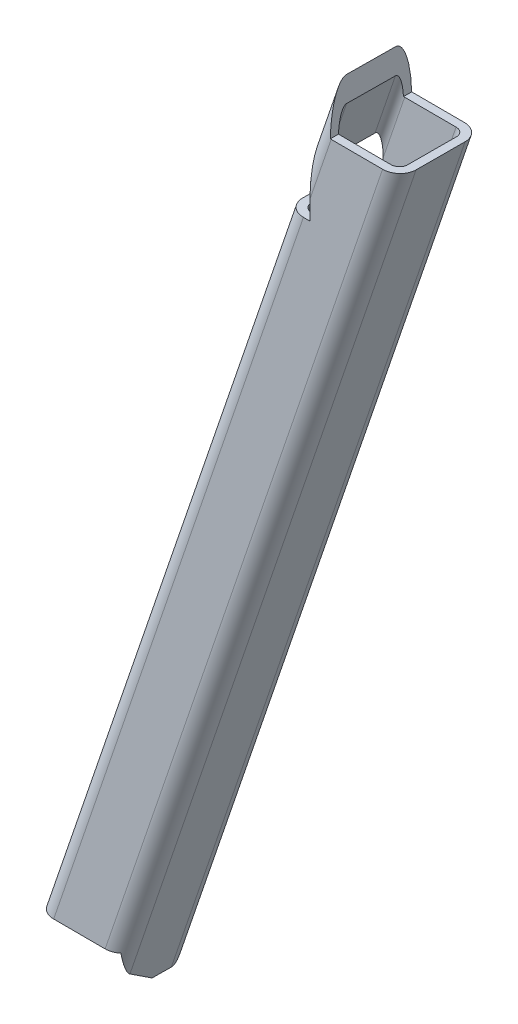
ISO-10303-21;
HEADER;
FILE_DESCRIPTION(('STEP AP214'),'2;1');
FILE_NAME('part.step','',(''),(''),'','','');
FILE_SCHEMA(('AUTOMOTIVE_DESIGN { 1 0 10303 214 1 1 1 1 }'));
ENDSEC;
DATA;
#1=APPLICATION_CONTEXT('core data for automotive mechanical design processes');
#2=APPLICATION_PROTOCOL_DEFINITION('international standard','automotive_design',2000,#1);
#3=PRODUCT_CONTEXT('',#1,'mechanical');
#4=PRODUCT('Part','Part','',(#3));
#5=PRODUCT_RELATED_PRODUCT_CATEGORY('part','',(#4));
#6=PRODUCT_DEFINITION_FORMATION('','',#4);
#7=PRODUCT_DEFINITION_CONTEXT('part definition',#1,'design');
#8=PRODUCT_DEFINITION('design','',#6,#7);
#9=PRODUCT_DEFINITION_SHAPE('','',#8);
#10=(LENGTH_UNIT() NAMED_UNIT(*) SI_UNIT(.MILLI.,.METRE.));
#11=(NAMED_UNIT(*) PLANE_ANGLE_UNIT() SI_UNIT($,.RADIAN.));
#12=(NAMED_UNIT(*) SI_UNIT($,.STERADIAN.) SOLID_ANGLE_UNIT());
#13=UNCERTAINTY_MEASURE_WITH_UNIT(LENGTH_MEASURE(1.E-05),#10,'distance_accuracy_value','');
#14=(GEOMETRIC_REPRESENTATION_CONTEXT(3) GLOBAL_UNCERTAINTY_ASSIGNED_CONTEXT((#13)) GLOBAL_UNIT_ASSIGNED_CONTEXT((#10,
#11,#12)) REPRESENTATION_CONTEXT('',''));
#15=CARTESIAN_POINT('',(0.,0.,0.));
#16=DIRECTION('',(0.,0.,1.));
#17=DIRECTION('',(1.,0.,0.));
#18=AXIS2_PLACEMENT_3D('',#15,#16,#17);
#19=CARTESIAN_POINT('',(244.349922816068,221.92616267634,-2010.01830949611));
#20=DIRECTION('',(-0.00289573675776996,0.000987182985603394,0.999995320078241));
#21=DIRECTION('',(0.99999580734144,0.,0.00289573816876252));
#22=AXIS2_PLACEMENT_3D('',#19,#20,#21);
#23=PLANE('',#22);
#24=DIRECTION('',(-0.99999580734144,0.,-0.00289573816876252));
#25=VECTOR('',#24,1.);
#26=CARTESIAN_POINT('',(244.349831551146,190.,-2009.98679264831));
#27=LINE('',#26,#25);
#28=CARTESIAN_POINT('',(235.,190.,-2010.01386742591));
#29=VERTEX_POINT('',#28);
#30=CARTESIAN_POINT('',(233.466003721887,190.,-2010.01830949611));
#31=VERTEX_POINT('',#30);
#32=EDGE_CURVE('E229',#29,#31,#27,.T.);
#33=ORIENTED_EDGE('',*,*,#32,.F.);
#34=DIRECTION('',(0.,-0.999999512730672,0.000987187124537908));
#35=VECTOR('',#34,1.);
#36=CARTESIAN_POINT('',(235.,221.926135948221,-2010.04538451162));
#37=LINE('',#36,#35);
#38=CARTESIAN_POINT('',(235.,194.499722415875,-2010.01830949611));
#39=VERTEX_POINT('',#38);
#40=EDGE_CURVE('E450',#39,#29,#37,.T.);
#41=ORIENTED_EDGE('',*,*,#40,.F.);
#42=DIRECTION('',(-0.322673927788139,-0.94651018817854,0.));
#43=VECTOR('',#42,1.);
#44=CARTESIAN_POINT('',(244.349922816068,221.92616267634,-2010.01830949611));
#45=LINE('',#44,#43);
#46=CARTESIAN_POINT('',(240.284185539947,210.,-2010.01830949611));
#47=VERTEX_POINT('',#46);
#48=EDGE_CURVE('E248',#47,#39,#45,.T.);
#49=ORIENTED_EDGE('',*,*,#48,.F.);
#50=DIRECTION('',(-0.99999580734144,0.,-0.00289573816876252));
#51=VECTOR('',#50,1.);
#52=CARTESIAN_POINT('',(244.349888723643,210.,-2010.00653623486));
#53=LINE('',#52,#51);
#54=CARTESIAN_POINT('',(252.962278170014,210.,-2009.98159690545));
#55=VERTEX_POINT('',#54);
#56=EDGE_CURVE('E281',#55,#47,#53,.T.);
#57=ORIENTED_EDGE('',*,*,#56,.F.);
#58=DIRECTION('',(-0.322673927788139,-0.94651018817854,0.));
#59=VECTOR('',#58,1.);
#60=CARTESIAN_POINT('',(255.707991919087,218.054093663948,-2009.98159690545));
#61=LINE('',#60,#59);
#62=CARTESIAN_POINT('',(184.780459988186,10.,-2009.98159690545));
#63=VERTEX_POINT('',#62);
#64=EDGE_CURVE('E45',#55,#63,#61,.T.);
#65=ORIENTED_EDGE('',*,*,#64,.T.);
#66=DIRECTION('',(0.99999580734144,0.,0.00289573816876252));
#67=VECTOR('',#66,1.);
#68=CARTESIAN_POINT('',(244.349316998674,10.,-2009.80910036932));
#69=LINE('',#68,#67);
#70=CARTESIAN_POINT('',(172.102367358225,9.99999999999998,-2010.01830949611));
#71=VERTEX_POINT('',#70);
#72=EDGE_CURVE('E247',#71,#63,#69,.T.);
#73=ORIENTED_EDGE('',*,*,#72,.F.);
#74=EDGE_CURVE('E240',#31,#71,#45,.T.);
#75=ORIENTED_EDGE('',*,*,#74,.F.);
#76=EDGE_LOOP('',(#33,#41,#49,#57,#65,#73,#75));
#77=FACE_BOUND('',#76,.T.);
#78=ADVANCED_FACE('F41',(#77),#23,.F.);
#79=CARTESIAN_POINT('',(255.696408972056,218.05804239589,-2005.98161562514));
#80=DIRECTION('',(-0.322673927788139,-0.94651018817854,0.));
#81=DIRECTION('',(0.94651018817854,-0.322673927788139,0.));
#82=AXIS2_PLACEMENT_3D('',#79,#80,#81);
#83=CYLINDRICAL_SURFACE('',#82,3.99999999999994);
#84=CARTESIAN_POINT('',(252.949349064366,210.,-2005.98161562514));
#85=DIRECTION('',(0.,1.,0.));
#86=DIRECTION('',(-1.,0.,0.));
#87=AXIS2_PLACEMENT_3D('',#84,#85,#86);
#88=ELLIPSE('',#87,4.22605065424338,3.99999999999994);
#89=CARTESIAN_POINT('',(257.175379941023,210.,-2005.96937809492));
#90=VERTEX_POINT('',#89);
#91=EDGE_CURVE('E285',#90,#55,#88,.T.);
#92=ORIENTED_EDGE('',*,*,#91,.F.);
#93=DIRECTION('',(-0.322673927788139,-0.94651018817854,0.));
#94=VECTOR('',#93,1.);
#95=CARTESIAN_POINT('',(259.482432006396,216.767352725092,-2005.96937809492));
#96=LINE('',#95,#94);
#97=CARTESIAN_POINT('',(185.,-1.71444782700178,-2005.96937809492));
#98=VERTEX_POINT('',#97);
#99=EDGE_CURVE('E272',#90,#98,#96,.T.);
#100=ORIENTED_EDGE('',*,*,#99,.T.);
#101=CARTESIAN_POINT('',(185.,10.681909411192,-2005.98161562514));
#102=DIRECTION('',(-1.,0.,0.));
#103=DIRECTION('',(0.,-1.,0.));
#104=AXIS2_PLACEMENT_3D('',#101,#102,#103);
#105=ELLIPSE('',#104,12.3964152524473,3.99999999999994);
#106=CARTESIAN_POINT('',(185.,10.,-2009.97555914853));
#107=VERTEX_POINT('',#106);
#108=EDGE_CURVE('E410',#107,#98,#105,.T.);
#109=ORIENTED_EDGE('',*,*,#108,.F.);
#110=CARTESIAN_POINT('',(184.767530882548,10.,-2005.98161562514));
#111=DIRECTION('',(0.,-1.,0.));
#112=DIRECTION('',(-1.,0.,0.));
#113=AXIS2_PLACEMENT_3D('',#110,#111,#112);
#114=ELLIPSE('',#113,4.22605065424338,3.99999999999994);
#115=EDGE_CURVE('E286',#63,#107,#114,.T.);
#116=ORIENTED_EDGE('',*,*,#115,.F.);
#117=ORIENTED_EDGE('',*,*,#64,.F.);
#118=EDGE_LOOP('',(#92,#100,#109,#116,#117));
#119=FACE_BOUND('',#118,.T.);
#120=ADVANCED_FACE('F283',(#119),#83,.T.);
#121=CARTESIAN_POINT('',(259.447683165303,216.77919892092,-1993.96943425398));
#122=DIRECTION('',(-0.946505758584915,0.322672417699403,-0.00305938255490178));
#123=DIRECTION('',(-0.322673927788139,-0.94651018817854,0.));
#124=AXIS2_PLACEMENT_3D('',#121,#122,#123);
#125=PLANE('',#124);
#126=DIRECTION('',(0.00323227465391467,0.,-0.999994776186637));
#127=VECTOR('',#126,1.);
#128=CARTESIAN_POINT('',(257.136616769428,210.,-1993.97690429434));
#129=LINE('',#128,#127);
#130=CARTESIAN_POINT('',(257.13659262408,210.,-1993.96943425398));
#131=VERTEX_POINT('',#130);
#132=EDGE_CURVE('E364',#131,#90,#129,.T.);
#133=ORIENTED_EDGE('',*,*,#132,.F.);
#134=DIRECTION('',(-0.322673927788139,-0.94651018817854,0.));
#135=VECTOR('',#134,1.);
#136=CARTESIAN_POINT('',(259.447683165303,216.77919892092,-1993.96943425398));
#137=LINE('',#136,#135);
#138=CARTESIAN_POINT('',(186.815405500549,3.7245177709752,-1993.96943425398));
#139=VERTEX_POINT('',#138);
#140=EDGE_CURVE('E270',#131,#139,#137,.T.);
#141=ORIENTED_EDGE('',*,*,#140,.T.);
#142=DIRECTION('',(0.196766618222741,0.584644563135723,0.787066472890966));
#143=VECTOR('',#142,1.);
#144=CARTESIAN_POINT('',(214.137014892353,84.9040924941325,-1884.68299668677));
#145=LINE('',#144,#143);
#146=CARTESIAN_POINT('',(185.,-1.66952195674525,-2001.23105625618));
#147=VERTEX_POINT('',#146);
#148=EDGE_CURVE('E478',#147,#139,#145,.T.);
#149=ORIENTED_EDGE('',*,*,#148,.F.);
#150=DIRECTION('',(0.,0.00948096236964959,0.999955054666231));
#151=VECTOR('',#150,1.);
#152=CARTESIAN_POINT('',(185.,-1.58104182610064,-1991.89907597549));
#153=LINE('',#152,#151);
#154=EDGE_CURVE('E411',#98,#147,#153,.T.);
#155=ORIENTED_EDGE('',*,*,#154,.F.);
#156=ORIENTED_EDGE('',*,*,#99,.F.);
#157=EDGE_LOOP('',(#133,#141,#149,#155,#156));
#158=FACE_BOUND('',#157,.T.);
#159=ADVANCED_FACE('F482',(#158),#125,.F.);
#160=CARTESIAN_POINT('',(255.661660130963,218.069888591717,-1993.9816717842));
#161=DIRECTION('',(-0.322673927788139,-0.94651018817854,0.));
#162=DIRECTION('',(0.94651018817854,-0.322673927788139,0.));
#163=AXIS2_PLACEMENT_3D('',#160,#161,#162);
#164=CYLINDRICAL_SURFACE('',#163,3.99999999999996);
#165=CARTESIAN_POINT('',(252.910561747423,210.,-1993.9816717842));
#166=DIRECTION('',(0.,1.,0.));
#167=DIRECTION('',(-1.,0.,0.));
#168=AXIS2_PLACEMENT_3D('',#165,#166,#167);
#169=ELLIPSE('',#168,4.2260506542434,3.99999999999996);
#170=CARTESIAN_POINT('',(252.897632641775,210.,-1989.98169050389));
#171=VERTEX_POINT('',#170);
#172=EDGE_CURVE('E362',#171,#131,#169,.T.);
#173=ORIENTED_EDGE('',*,*,#172,.F.);
#174=DIRECTION('',(-0.322673927788139,-0.94651018817854,0.));
#175=VECTOR('',#174,1.);
#176=CARTESIAN_POINT('',(255.650077183932,218.07383732366,-1989.98169050389));
#177=LINE('',#176,#175);
#178=CARTESIAN_POINT('',(184.715814459933,10.,-1989.98169050389));
#179=VERTEX_POINT('',#178);
#180=EDGE_CURVE('E267',#171,#179,#177,.T.);
#181=ORIENTED_EDGE('',*,*,#180,.T.);
#182=CARTESIAN_POINT('',(184.728743565605,10.,-1993.9816717842));
#183=DIRECTION('',(0.,-1.,0.));
#184=DIRECTION('',(-1.,0.,0.));
#185=AXIS2_PLACEMENT_3D('',#182,#183,#184);
#186=ELLIPSE('',#185,4.2260506542434,3.99999999999996);
#187=CARTESIAN_POINT('',(187.555672242524,10.,-1991.00836728608));
#188=VERTEX_POINT('',#187);
#189=EDGE_CURVE('E390',#188,#179,#186,.T.);
#190=ORIENTED_EDGE('',*,*,#189,.F.);
#191=CARTESIAN_POINT('',(186.812346117994,16.1119008203417,-1993.9816717842));
#192=DIRECTION('',(-0.970142500145332,0.,0.242535625036333));
#193=DIRECTION('',(-0.0199852784923983,-0.996599220820929,-0.0799411139695932));
#194=AXIS2_PLACEMENT_3D('',#191,#192,#193);
#195=ELLIPSE('',#194,12.7779323662145,3.99999999999996);
#196=EDGE_CURVE('E189',#139,#188,#195,.T.);
#197=ORIENTED_EDGE('',*,*,#196,.F.);
#198=ORIENTED_EDGE('',*,*,#140,.F.);
#199=EDGE_LOOP('',(#173,#181,#190,#197,#198));
#200=FACE_BOUND('',#199,.T.);
#201=ADVANCED_FACE('F564',(#200),#164,.T.);
#202=CARTESIAN_POINT('',(255.650077183932,218.07383732366,-1989.98169050389));
#203=DIRECTION('',(0.00289573675776996,-0.000987182985603394,-0.999995320078241));
#204=DIRECTION('',(-0.99999580734144,0.,-0.00289573816876252));
#205=AXIS2_PLACEMENT_3D('',#202,#203,#204);
#206=PLANE('',#205);
#207=DIRECTION('',(0.99999580734144,0.,0.00289573816876252));
#208=VECTOR('',#207,1.);
#209=CARTESIAN_POINT('',(255.649996931363,190.,-1989.95397659203));
#210=LINE('',#209,#208);
#211=CARTESIAN_POINT('',(233.401358193622,190.,-1990.01840309455));
#212=VERTEX_POINT('',#211);
#213=CARTESIAN_POINT('',(235.,190.,-1990.01377382704));
#214=VERTEX_POINT('',#213);
#215=EDGE_CURVE('E451',#212,#214,#210,.T.);
#216=ORIENTED_EDGE('',*,*,#215,.F.);
#217=DIRECTION('',(-0.322673927788139,-0.94651018817854,0.));
#218=VECTOR('',#217,1.);
#219=CARTESIAN_POINT('',(244.292008080913,221.945906336052,-1990.01840309455));
#220=LINE('',#219,#218);
#221=CARTESIAN_POINT('',(172.037721829986,10.,-1990.01840309455));
#222=VERTEX_POINT('',#221);
#223=EDGE_CURVE('E266',#212,#222,#220,.T.);
#224=ORIENTED_EDGE('',*,*,#223,.T.);
#225=DIRECTION('',(-0.99999580734144,0.,-0.00289573816876252));
#226=VECTOR('',#225,1.);
#227=CARTESIAN_POINT('',(255.649482378891,10.,-1989.77628431305));
#228=LINE('',#227,#226);
#229=EDGE_CURVE('E392',#179,#222,#228,.T.);
#230=ORIENTED_EDGE('',*,*,#229,.F.);
#231=ORIENTED_EDGE('',*,*,#180,.F.);
#232=DIRECTION('',(0.99999580734144,0.,0.00289573816876252));
#233=VECTOR('',#232,1.);
#234=CARTESIAN_POINT('',(255.65005410386,210.,-1989.97372017859));
#235=LINE('',#234,#233);
#236=CARTESIAN_POINT('',(240.219540011848,210.,-1990.01840309455));
#237=VERTEX_POINT('',#236);
#238=EDGE_CURVE('E359',#237,#171,#235,.T.);
#239=ORIENTED_EDGE('',*,*,#238,.F.);
#240=CARTESIAN_POINT('',(235.,194.689349298708,-1990.01840309455));
#241=VERTEX_POINT('',#240);
#242=EDGE_CURVE('E263',#237,#241,#220,.T.);
#243=ORIENTED_EDGE('',*,*,#242,.T.);
#244=DIRECTION('',(0.,0.999999512730672,-0.000987187124537908));
#245=VECTOR('',#244,1.);
#246=CARTESIAN_POINT('',(235.,218.073778292398,-1990.04148791301));
#247=LINE('',#246,#245);
#248=EDGE_CURVE('E464',#214,#241,#247,.T.);
#249=ORIENTED_EDGE('',*,*,#248,.F.);
#250=EDGE_LOOP('',(#216,#224,#230,#231,#239,#243,#249));
#251=FACE_BOUND('',#250,.T.);
#252=ADVANCED_FACE('F528',(#251),#206,.F.);
#253=CARTESIAN_POINT('',(244.303591027944,221.94195760411,-1994.01838437486));
#254=DIRECTION('',(-0.322673927788139,-0.94651018817854,0.));
#255=DIRECTION('',(0.94651018817854,-0.322673927788139,0.));
#256=AXIS2_PLACEMENT_3D('',#253,#254,#255);
#257=CYLINDRICAL_SURFACE('',#256,3.99999999999994);
#258=CARTESIAN_POINT('',(233.41428729927,190.,-1994.01838437486));
#259=DIRECTION('',(0.,1.,0.));
#260=DIRECTION('',(-1.,0.,0.));
#261=AXIS2_PLACEMENT_3D('',#258,#259,#260);
#262=ELLIPSE('',#261,4.22605065424338,3.99999999999994);
#263=CARTESIAN_POINT('',(229.188256422613,190.,-1994.03062190508));
#264=VERTEX_POINT('',#263);
#265=EDGE_CURVE('E453',#264,#212,#262,.T.);
#266=ORIENTED_EDGE('',*,*,#265,.F.);
#267=DIRECTION('',(-0.322673927788139,-0.94651018817854,0.));
#268=VECTOR('',#267,1.);
#269=CARTESIAN_POINT('',(240.517567993604,223.232647274908,-1994.03062190508));
#270=LINE('',#269,#268);
#271=CARTESIAN_POINT('',(167.824620058977,10.,-1994.03062190508));
#272=VERTEX_POINT('',#271);
#273=EDGE_CURVE('E262',#264,#272,#270,.T.);
#274=ORIENTED_EDGE('',*,*,#273,.T.);
#275=CARTESIAN_POINT('',(172.050650935634,10.,-1994.01838437486));
#276=DIRECTION('',(0.,-1.,0.));
#277=DIRECTION('',(-1.,0.,0.));
#278=AXIS2_PLACEMENT_3D('',#275,#276,#277);
#279=ELLIPSE('',#278,4.22605065424338,3.99999999999994);
#280=EDGE_CURVE('E394',#222,#272,#279,.T.);
#281=ORIENTED_EDGE('',*,*,#280,.F.);
#282=ORIENTED_EDGE('',*,*,#223,.F.);
#283=EDGE_LOOP('',(#266,#274,#281,#282));
#284=FACE_BOUND('',#283,.T.);
#285=ADVANCED_FACE('F532',(#284),#257,.T.);
#286=CARTESIAN_POINT('',(235.,194.651423922141,-1994.01838437486));
#287=DIRECTION('',(-1.,0.,0.));
#288=DIRECTION('',(0.,-1.,0.));
#289=AXIS2_PLACEMENT_3D('',#286,#287,#288);
#290=ELLIPSE('',#289,12.3964152524473,3.99999999999994);
#291=CARTESIAN_POINT('',(235.,207.047781160335,-1994.03062190508));
#292=VERTEX_POINT('',#291);
#293=EDGE_CURVE('E466',#241,#292,#290,.T.);
#294=ORIENTED_EDGE('',*,*,#293,.F.);
#295=ORIENTED_EDGE('',*,*,#242,.F.);
#296=CARTESIAN_POINT('',(240.232469117452,210.,-1994.01838437486));
#297=DIRECTION('',(0.,1.,0.));
#298=DIRECTION('',(-1.,0.,0.));
#299=AXIS2_PLACEMENT_3D('',#296,#297,#298);
#300=ELLIPSE('',#299,4.22605065424338,3.99999999999994);
#301=CARTESIAN_POINT('',(240.,210.,-1990.02444085147));
#302=VERTEX_POINT('',#301);
#303=EDGE_CURVE('E357',#302,#237,#300,.T.);
#304=ORIENTED_EDGE('',*,*,#303,.F.);
#305=CARTESIAN_POINT('',(240.,209.318090588808,-1994.01838437486));
#306=DIRECTION('',(1.,0.,0.));
#307=DIRECTION('',(0.,-1.,0.));
#308=AXIS2_PLACEMENT_3D('',#305,#306,#307);
#309=ELLIPSE('',#308,12.3964152524473,3.99999999999994);
#310=CARTESIAN_POINT('',(240.,221.714447827001,-1994.03062190508));
#311=VERTEX_POINT('',#310);
#312=EDGE_CURVE('E493',#311,#302,#309,.T.);
#313=ORIENTED_EDGE('',*,*,#312,.F.);
#314=EDGE_CURVE('E259',#311,#292,#270,.T.);
#315=ORIENTED_EDGE('',*,*,#314,.T.);
#316=EDGE_LOOP('',(#294,#295,#304,#313,#315));
#317=FACE_BOUND('',#316,.T.);
#318=ADVANCED_FACE('F542',(#317),#257,.T.);
#319=CARTESIAN_POINT('',(240.552316834697,223.22080107908,-2006.03056574602));
#320=DIRECTION('',(0.946505758584915,-0.322672417699403,0.00305938255490178));
#321=DIRECTION('',(0.322673927788139,0.94651018817854,0.));
#322=AXIS2_PLACEMENT_3D('',#319,#320,#321);
#323=PLANE('',#322);
#324=DIRECTION('',(-0.00323227465391467,0.,0.999994776186637));
#325=VECTOR('',#324,1.);
#326=CARTESIAN_POINT('',(229.227162061473,190.,-2006.06717194797));
#327=LINE('',#326,#325);
#328=CARTESIAN_POINT('',(229.227043739556,190.,-2006.03056574602));
#329=VERTEX_POINT('',#328);
#330=EDGE_CURVE('E243',#329,#264,#327,.T.);
#331=ORIENTED_EDGE('',*,*,#330,.F.);
#332=DIRECTION('',(-0.322673927788139,-0.94651018817854,0.));
#333=VECTOR('',#332,1.);
#334=CARTESIAN_POINT('',(240.552316834697,223.22080107908,-2006.03056574602));
#335=LINE('',#334,#333);
#336=CARTESIAN_POINT('',(167.86340737592,10.,-2006.03056574602));
#337=VERTEX_POINT('',#336);
#338=EDGE_CURVE('E242',#329,#337,#335,.T.);
#339=ORIENTED_EDGE('',*,*,#338,.T.);
#340=DIRECTION('',(0.00323227465391467,0.,-0.999994776186637));
#341=VECTOR('',#340,1.);
#342=CARTESIAN_POINT('',(167.86416680053,10.,-2006.26551503835));
#343=LINE('',#342,#341);
#344=EDGE_CURVE('E396',#272,#337,#343,.T.);
#345=ORIENTED_EDGE('',*,*,#344,.F.);
#346=ORIENTED_EDGE('',*,*,#273,.F.);
#347=EDGE_LOOP('',(#331,#339,#345,#346));
#348=FACE_BOUND('',#347,.T.);
#349=ADVANCED_FACE('F539',(#348),#323,.F.);
#350=DIRECTION('',(0.,-0.00948096236964905,-0.999955054666231));
#351=VECTOR('',#350,1.);
#352=CARTESIAN_POINT('',(235.,206.935469028704,-2005.87615818577));
#353=LINE('',#352,#351);
#354=CARTESIAN_POINT('',(235.,206.934005030635,-2006.03056574602));
#355=VERTEX_POINT('',#354);
#356=EDGE_CURVE('E468',#292,#355,#353,.T.);
#357=ORIENTED_EDGE('',*,*,#356,.F.);
#358=ORIENTED_EDGE('',*,*,#314,.F.);
#359=DIRECTION('',(0.,0.00948096236964905,0.999955054666231));
#360=VECTOR('',#359,1.);
#361=CARTESIAN_POINT('',(240.,221.60081732854,-2006.01520605069));
#362=LINE('',#361,#360);
#363=CARTESIAN_POINT('',(240.,221.600671697302,-2006.03056574602));
#364=VERTEX_POINT('',#363);
#365=EDGE_CURVE('E495',#364,#311,#362,.T.);
#366=ORIENTED_EDGE('',*,*,#365,.F.);
#367=EDGE_CURVE('E249',#364,#355,#335,.T.);
#368=ORIENTED_EDGE('',*,*,#367,.T.);
#369=EDGE_LOOP('',(#357,#358,#366,#368));
#370=FACE_BOUND('',#369,.T.);
#371=ADVANCED_FACE('F541',(#370),#323,.F.);
#372=CARTESIAN_POINT('',(244.338339869037,221.930111408283,-2006.0183282158));
#373=DIRECTION('',(-0.322673927788139,-0.94651018817854,0.));
#374=DIRECTION('',(0.94651018817854,-0.322673927788139,0.));
#375=AXIS2_PLACEMENT_3D('',#372,#373,#374);
#376=CYLINDRICAL_SURFACE('',#375,3.99999999999996);
#377=CARTESIAN_POINT('',(233.453074616213,190.,-2006.0183282158));
#378=DIRECTION('',(0.,1.,0.));
#379=DIRECTION('',(-1.,0.,0.));
#380=AXIS2_PLACEMENT_3D('',#377,#378,#379);
#381=ELLIPSE('',#380,4.2260506542434,3.99999999999996);
#382=EDGE_CURVE('E225',#31,#329,#381,.T.);
#383=ORIENTED_EDGE('',*,*,#382,.F.);
#384=ORIENTED_EDGE('',*,*,#74,.T.);
#385=CARTESIAN_POINT('',(172.089438252577,10.,-2006.0183282158));
#386=DIRECTION('',(0.,-1.,0.));
#387=DIRECTION('',(-1.,0.,0.));
#388=AXIS2_PLACEMENT_3D('',#385,#386,#387);
#389=ELLIPSE('',#388,4.2260506542434,3.99999999999996);
#390=EDGE_CURVE('E398',#337,#71,#389,.T.);
#391=ORIENTED_EDGE('',*,*,#390,.F.);
#392=ORIENTED_EDGE('',*,*,#338,.F.);
#393=EDGE_LOOP('',(#383,#384,#391,#392));
#394=FACE_BOUND('',#393,.T.);
#395=ADVANCED_FACE('F43',(#394),#376,.T.);
#396=CARTESIAN_POINT('',(235.,194.537647792441,-2006.0183282158));
#397=DIRECTION('',(-1.,0.,0.));
#398=DIRECTION('',(0.,-1.,0.));
#399=AXIS2_PLACEMENT_3D('',#396,#397,#398);
#400=ELLIPSE('',#399,12.3964152524473,3.99999999999996);
#401=EDGE_CURVE('E470',#355,#39,#400,.T.);
#402=ORIENTED_EDGE('',*,*,#401,.F.);
#403=ORIENTED_EDGE('',*,*,#367,.F.);
#404=CARTESIAN_POINT('',(240.,209.204314459108,-2006.0183282158));
#405=DIRECTION('',(1.,0.,0.));
#406=DIRECTION('',(0.,-1.,0.));
#407=AXIS2_PLACEMENT_3D('',#404,#405,#406);
#408=ELLIPSE('',#407,12.3964152524473,3.99999999999996);
#409=CARTESIAN_POINT('',(240.,210.,-2010.01007983494));
#410=VERTEX_POINT('',#409);
#411=EDGE_CURVE('E487',#410,#364,#408,.T.);
#412=ORIENTED_EDGE('',*,*,#411,.F.);
#413=CARTESIAN_POINT('',(240.271256434395,210.,-2006.0183282158));
#414=DIRECTION('',(0.,1.,0.));
#415=DIRECTION('',(-1.,0.,0.));
#416=AXIS2_PLACEMENT_3D('',#413,#414,#415);
#417=ELLIPSE('',#416,4.2260506542434,3.99999999999996);
#418=EDGE_CURVE('E355',#47,#410,#417,.T.);
#419=ORIENTED_EDGE('',*,*,#418,.F.);
#420=ORIENTED_EDGE('',*,*,#48,.T.);
#421=EDGE_LOOP('',(#402,#403,#412,#419,#420));
#422=FACE_BOUND('',#421,.T.);
#423=ADVANCED_FACE('F614',(#422),#376,.T.);
#424=CARTESIAN_POINT('',(-143.999999999999,10.,-200.));
#425=DIRECTION('',(0.,-1.,0.));
#426=DIRECTION('',(0.,0.,-1.));
#427=AXIS2_PLACEMENT_3D('',#424,#425,#426);
#428=PLANE('',#427);
#429=DIRECTION('',(0.99999580734144,0.,0.00289573816872749));
#430=VECTOR('',#429,1.);
#431=CARTESIAN_POINT('',(244.343525519515,10.,-2007.80910778011));
#432=LINE('',#431,#430);
#433=CARTESIAN_POINT('',(172.095902805401,10.,-2008.01831885596));
#434=VERTEX_POINT('',#433);
#435=CARTESIAN_POINT('',(184.773995435377,10.,-2007.9816062653));
#436=VERTEX_POINT('',#435);
#437=EDGE_CURVE('E368',#434,#436,#432,.T.);
#438=ORIENTED_EDGE('',*,*,#437,.F.);
#439=CARTESIAN_POINT('',(172.089438252577,10.,-2006.0183282158));
#440=DIRECTION('',(0.,-1.,0.));
#441=DIRECTION('',(-1.,0.,0.));
#442=AXIS2_PLACEMENT_3D('',#439,#440,#441);
#443=ELLIPSE('',#442,2.11302532712158,1.99999999999987);
#444=CARTESIAN_POINT('',(169.976422814248,10.,-2006.02444698091));
#445=VERTEX_POINT('',#444);
#446=EDGE_CURVE('E373',#445,#434,#443,.T.);
#447=ORIENTED_EDGE('',*,*,#446,.F.);
#448=DIRECTION('',(0.00323227465391467,0.,-0.999994776186637));
#449=VECTOR('',#448,1.);
#450=CARTESIAN_POINT('',(169.977179940345,10.,-2006.25868516385));
#451=LINE('',#450,#449);
#452=CARTESIAN_POINT('',(169.937635497305,10.,-1994.02450313997));
#453=VERTEX_POINT('',#452);
#454=EDGE_CURVE('E378',#453,#445,#451,.T.);
#455=ORIENTED_EDGE('',*,*,#454,.F.);
#456=CARTESIAN_POINT('',(172.050650935634,10.,-1994.01838437486));
#457=DIRECTION('',(0.,-1.,0.));
#458=DIRECTION('',(-1.,0.,0.));
#459=AXIS2_PLACEMENT_3D('',#456,#457,#458);
#460=ELLIPSE('',#459,2.1130253271218,2.00000000000008);
#461=CARTESIAN_POINT('',(172.04418638281,10.,-1992.0183937347));
#462=VERTEX_POINT('',#461);
#463=EDGE_CURVE('E383',#462,#453,#460,.T.);
#464=ORIENTED_EDGE('',*,*,#463,.F.);
#465=DIRECTION('',(-0.99999580734144,0.,-0.00289573816872749));
#466=VECTOR('',#465,1.);
#467=CARTESIAN_POINT('',(255.655273858051,10.,-1991.77627690226));
#468=LINE('',#467,#466);
#469=CARTESIAN_POINT('',(184.722279012774,10.,-1991.98168114404));
#470=VERTEX_POINT('',#469);
#471=EDGE_CURVE('E343',#470,#462,#468,.T.);
#472=ORIENTED_EDGE('',*,*,#471,.F.);
#473=CARTESIAN_POINT('',(184.728743565605,10.,-1993.9816717842));
#474=DIRECTION('',(0.,-1.,0.));
#475=DIRECTION('',(-1.,0.,0.));
#476=AXIS2_PLACEMENT_3D('',#473,#474,#475);
#477=ELLIPSE('',#476,2.11302532712158,1.99999999999987);
#478=CARTESIAN_POINT('',(186.838807677418,10.,-1993.87582554651));
#479=VERTEX_POINT('',#478);
#480=EDGE_CURVE('E332',#479,#470,#477,.T.);
#481=ORIENTED_EDGE('',*,*,#480,.F.);
#482=DIRECTION('',(0.242535625036333,0.,0.970142500145332));
#483=VECTOR('',#482,1.);
#484=CARTESIAN_POINT('',(184.701425001453,10.,-2002.42535625036));
#485=LINE('',#484,#483);
#486=EDGE_CURVE('E252',#479,#188,#485,.T.);
#487=ORIENTED_EDGE('',*,*,#486,.T.);
#488=ORIENTED_EDGE('',*,*,#189,.T.);
#489=ORIENTED_EDGE('',*,*,#229,.T.);
#490=ORIENTED_EDGE('',*,*,#280,.T.);
#491=ORIENTED_EDGE('',*,*,#344,.T.);
#492=ORIENTED_EDGE('',*,*,#390,.T.);
#493=ORIENTED_EDGE('',*,*,#72,.T.);
#494=ORIENTED_EDGE('',*,*,#115,.T.);
#495=DIRECTION('',(0.,0.,1.));
#496=VECTOR('',#495,1.);
#497=CARTESIAN_POINT('',(185.,10.,-2300.));
#498=LINE('',#497,#496);
#499=CARTESIAN_POINT('',(185.,10.,-2007.96947499342));
#500=VERTEX_POINT('',#499);
#501=EDGE_CURVE('E402',#107,#500,#498,.T.);
#502=ORIENTED_EDGE('',*,*,#501,.T.);
#503=CARTESIAN_POINT('',(184.767530882548,10.,-2005.98161562514));
#504=DIRECTION('',(0.,-1.,0.));
#505=DIRECTION('',(-1.,0.,0.));
#506=AXIS2_PLACEMENT_3D('',#503,#504,#505);
#507=ELLIPSE('',#506,2.1130253271218,2.00000000000008);
#508=EDGE_CURVE('E325',#436,#500,#507,.T.);
#509=ORIENTED_EDGE('',*,*,#508,.F.);
#510=EDGE_LOOP('',(#438,#447,#455,#464,#472,#481,#487,#488,#489,#490,#491,#492,#493,#494,#502,#509));
#511=FACE_BOUND('',#510,.T.);
#512=ADVANCED_FACE('F537',(#511),#428,.T.);
#513=CARTESIAN_POINT('',(184.701425001453,-6.00000000000001,-2002.42535625036));
#514=DIRECTION('',(-0.970142500145332,0.,0.242535625036333));
#515=DIRECTION('',(0.242535625036333,0.,0.970142500145332));
#516=AXIS2_PLACEMENT_3D('',#513,#514,#515);
#517=PLANE('',#516);
#518=ORIENTED_EDGE('',*,*,#196,.T.);
#519=ORIENTED_EDGE('',*,*,#486,.F.);
#520=CARTESIAN_POINT('',(186.812346117994,16.1119008203417,-1993.9816717842));
#521=DIRECTION('',(-0.970142500145332,0.,0.242535625036333));
#522=DIRECTION('',(-0.0199852784923983,-0.996599220820929,-0.0799411139695932));
#523=AXIS2_PLACEMENT_3D('',#520,#521,#522);
#524=ELLIPSE('',#523,6.3889661831069,1.99999999999987);
#525=CARTESIAN_POINT('',(186.813875809272,9.91820929565842,-1993.97555301909));
#526=VERTEX_POINT('',#525);
#527=EDGE_CURVE('E196',#526,#479,#524,.T.);
#528=ORIENTED_EDGE('',*,*,#527,.F.);
#529=DIRECTION('',(0.196766618222741,0.584644563135723,0.787066472890966));
#530=VECTOR('',#529,1.);
#531=CARTESIAN_POINT('',(213.423978839437,88.9837144183653,-1887.53514089843));
#532=LINE('',#531,#530);
#533=CARTESIAN_POINT('',(185.,4.52871467674093,-2001.23105625618));
#534=VERTEX_POINT('',#533);
#535=EDGE_CURVE('E316',#534,#526,#532,.T.);
#536=ORIENTED_EDGE('',*,*,#535,.F.);
#537=DIRECTION('',(0.,1.,0.));
#538=VECTOR('',#537,1.);
#539=CARTESIAN_POINT('',(185.,-6.00000000000001,-2001.23105625618));
#540=LINE('',#539,#538);
#541=EDGE_CURVE('E313',#147,#534,#540,.T.);
#542=ORIENTED_EDGE('',*,*,#541,.F.);
#543=ORIENTED_EDGE('',*,*,#148,.T.);
#544=EDGE_LOOP('',(#518,#519,#528,#536,#542,#543));
#545=FACE_BOUND('',#544,.T.);
#546=ADVANCED_FACE('F476',(#545),#517,.T.);
#547=CARTESIAN_POINT('',(185.,-6.00000000000001,-2300.));
#548=DIRECTION('',(-1.,0.,0.));
#549=DIRECTION('',(0.,0.,1.));
#550=AXIS2_PLACEMENT_3D('',#547,#548,#549);
#551=PLANE('',#550);
#552=ORIENTED_EDGE('',*,*,#154,.T.);
#553=ORIENTED_EDGE('',*,*,#541,.T.);
#554=DIRECTION('',(0.,0.00948096236964959,0.999955054666231));
#555=VECTOR('',#554,1.);
#556=CARTESIAN_POINT('',(185.,4.61663765627793,-1991.95783858254));
#557=LINE('',#556,#555);
#558=CARTESIAN_POINT('',(185.,4.4837307920951,-2005.97549686003));
#559=VERTEX_POINT('',#558);
#560=EDGE_CURVE('E306',#559,#534,#557,.T.);
#561=ORIENTED_EDGE('',*,*,#560,.F.);
#562=CARTESIAN_POINT('',(185.,10.681909411192,-2005.98161562514));
#563=DIRECTION('',(-1.,0.,0.));
#564=DIRECTION('',(0.,-1.,0.));
#565=AXIS2_PLACEMENT_3D('',#562,#563,#564);
#566=ELLIPSE('',#565,6.19820762622395,2.00000000000008);
#567=EDGE_CURVE('E310',#500,#559,#566,.T.);
#568=ORIENTED_EDGE('',*,*,#567,.F.);
#569=ORIENTED_EDGE('',*,*,#501,.F.);
#570=ORIENTED_EDGE('',*,*,#108,.T.);
#571=EDGE_LOOP('',(#552,#553,#561,#568,#569,#570));
#572=FACE_BOUND('',#571,.T.);
#573=ADVANCED_FACE('F308',(#572),#551,.T.);
#574=CARTESIAN_POINT('',(240.,214.,-2000.));
#575=DIRECTION('',(1.,0.,0.));
#576=DIRECTION('',(0.,0.,-1.));
#577=AXIS2_PLACEMENT_3D('',#574,#575,#576);
#578=PLANE('',#577);
#579=ORIENTED_EDGE('',*,*,#411,.T.);
#580=ORIENTED_EDGE('',*,*,#365,.T.);
#581=ORIENTED_EDGE('',*,*,#312,.T.);
#582=DIRECTION('',(0.,0.,-1.));
#583=VECTOR('',#582,1.);
#584=CARTESIAN_POINT('',(240.,210.,-2000.));
#585=LINE('',#584,#583);
#586=CARTESIAN_POINT('',(240.,210.,-1992.03052500658));
#587=VERTEX_POINT('',#586);
#588=EDGE_CURVE('E407',#302,#587,#585,.T.);
#589=ORIENTED_EDGE('',*,*,#588,.T.);
#590=CARTESIAN_POINT('',(240.,209.318090588808,-1994.01838437486));
#591=DIRECTION('',(1.,0.,0.));
#592=DIRECTION('',(0.,-1.,0.));
#593=AXIS2_PLACEMENT_3D('',#590,#591,#592);
#594=ELLIPSE('',#593,6.19820762622395,2.00000000000008);
#595=CARTESIAN_POINT('',(240.,215.516269207904,-1994.02450313997));
#596=VERTEX_POINT('',#595);
#597=EDGE_CURVE('E51',#596,#587,#594,.T.);
#598=ORIENTED_EDGE('',*,*,#597,.F.);
#599=DIRECTION('',(0.,0.00948096236964905,0.999955054666231));
#600=VECTOR('',#599,1.);
#601=CARTESIAN_POINT('',(240.,215.403137846162,-2005.95644344364));
#602=LINE('',#601,#600);
#603=CARTESIAN_POINT('',(240.,215.402493078204,-2006.02444698091));
#604=VERTEX_POINT('',#603);
#605=EDGE_CURVE('E446',#604,#596,#602,.T.);
#606=ORIENTED_EDGE('',*,*,#605,.F.);
#607=CARTESIAN_POINT('',(240.,209.204314459108,-2006.0183282158));
#608=DIRECTION('',(1.,0.,0.));
#609=DIRECTION('',(0.,-1.,0.));
#610=AXIS2_PLACEMENT_3D('',#607,#608,#609);
#611=ELLIPSE('',#610,6.1982076262233,1.99999999999987);
#612=CARTESIAN_POINT('',(240.,210.,-2008.00178000218));
#613=VERTEX_POINT('',#612);
#614=EDGE_CURVE('E442',#613,#604,#611,.T.);
#615=ORIENTED_EDGE('',*,*,#614,.F.);
#616=EDGE_CURVE('E360',#613,#410,#585,.T.);
#617=ORIENTED_EDGE('',*,*,#616,.T.);
#618=EDGE_LOOP('',(#579,#580,#581,#589,#598,#606,#615,#617));
#619=FACE_BOUND('',#618,.T.);
#620=ADVANCED_FACE('F636',(#619),#578,.T.);
#621=CARTESIAN_POINT('',(244.,210.,-2000.));
#622=DIRECTION('',(0.,1.,0.));
#623=DIRECTION('',(0.,0.,1.));
#624=AXIS2_PLACEMENT_3D('',#621,#622,#623);
#625=PLANE('',#624);
#626=ORIENTED_EDGE('',*,*,#588,.F.);
#627=ORIENTED_EDGE('',*,*,#303,.T.);
#628=ORIENTED_EDGE('',*,*,#238,.T.);
#629=ORIENTED_EDGE('',*,*,#172,.T.);
#630=ORIENTED_EDGE('',*,*,#132,.T.);
#631=ORIENTED_EDGE('',*,*,#91,.T.);
#632=ORIENTED_EDGE('',*,*,#56,.T.);
#633=ORIENTED_EDGE('',*,*,#418,.T.);
#634=ORIENTED_EDGE('',*,*,#616,.F.);
#635=CARTESIAN_POINT('',(240.271256434395,210.,-2006.0183282158));
#636=DIRECTION('',(0.,1.,0.));
#637=DIRECTION('',(-1.,0.,0.));
#638=AXIS2_PLACEMENT_3D('',#635,#636,#637);
#639=ELLIPSE('',#638,2.11302532712158,1.99999999999987);
#640=CARTESIAN_POINT('',(240.277720987196,210.,-2008.01831885596));
#641=VERTEX_POINT('',#640);
#642=EDGE_CURVE('E457',#641,#613,#639,.T.);
#643=ORIENTED_EDGE('',*,*,#642,.F.);
#644=DIRECTION('',(-0.99999580734144,0.,-0.00289573816872749));
#645=VECTOR('',#644,1.);
#646=CARTESIAN_POINT('',(244.344097244484,210.,-2008.00654364565));
#647=LINE('',#646,#645);
#648=CARTESIAN_POINT('',(252.95581361719,210.,-2007.9816062653));
#649=VERTEX_POINT('',#648);
#650=EDGE_CURVE('E371',#649,#641,#647,.T.);
#651=ORIENTED_EDGE('',*,*,#650,.F.);
#652=CARTESIAN_POINT('',(252.949349064366,210.,-2005.98161562514));
#653=DIRECTION('',(0.,1.,0.));
#654=DIRECTION('',(-1.,0.,0.));
#655=AXIS2_PLACEMENT_3D('',#652,#653,#654);
#656=ELLIPSE('',#655,2.1130253271218,2.00000000000008);
#657=CARTESIAN_POINT('',(255.062364502695,210.,-2005.97549686003));
#658=VERTEX_POINT('',#657);
#659=EDGE_CURVE('E474',#658,#649,#656,.T.);
#660=ORIENTED_EDGE('',*,*,#659,.F.);
#661=DIRECTION('',(0.00323227465391467,0.,-0.999994776186637));
#662=VECTOR('',#661,1.);
#663=CARTESIAN_POINT('',(255.023603629613,210.,-1993.98373416883));
#664=LINE('',#663,#662);
#665=CARTESIAN_POINT('',(255.023577185752,210.,-1993.97555301909));
#666=VERTEX_POINT('',#665);
#667=EDGE_CURVE('E330',#666,#658,#664,.T.);
#668=ORIENTED_EDGE('',*,*,#667,.F.);
#669=CARTESIAN_POINT('',(252.910561747423,210.,-1993.9816717842));
#670=DIRECTION('',(0.,1.,0.));
#671=DIRECTION('',(-1.,0.,0.));
#672=AXIS2_PLACEMENT_3D('',#669,#670,#671);
#673=ELLIPSE('',#672,2.11302532712158,1.99999999999987);
#674=CARTESIAN_POINT('',(252.904097194599,210.,-1991.98168114404));
#675=VERTEX_POINT('',#674);
#676=EDGE_CURVE('E339',#675,#666,#673,.T.);
#677=ORIENTED_EDGE('',*,*,#676,.F.);
#678=DIRECTION('',(0.99999580734144,0.,0.00289573816872749));
#679=VECTOR('',#678,1.);
#680=CARTESIAN_POINT('',(255.65584558302,210.,-1991.9737127678));
#681=LINE('',#680,#679);
#682=CARTESIAN_POINT('',(240.22600456467,210.,-1992.0183937347));
#683=VERTEX_POINT('',#682);
#684=EDGE_CURVE('E351',#683,#675,#681,.T.);
#685=ORIENTED_EDGE('',*,*,#684,.F.);
#686=CARTESIAN_POINT('',(240.232469117452,210.,-1994.01838437486));
#687=DIRECTION('',(0.,1.,0.));
#688=DIRECTION('',(-1.,0.,0.));
#689=AXIS2_PLACEMENT_3D('',#686,#687,#688);
#690=ELLIPSE('',#689,2.1130253271218,2.00000000000008);
#691=EDGE_CURVE('E11',#587,#683,#690,.T.);
#692=ORIENTED_EDGE('',*,*,#691,.F.);
#693=EDGE_LOOP('',(#626,#627,#628,#629,#630,#631,#632,#633,#634,#643,#651,#660,#668,#677,#685,#692));
#694=FACE_BOUND('',#693,.T.);
#695=ADVANCED_FACE('F643',(#694),#625,.T.);
#696=CARTESIAN_POINT('',(219.,190.,-200.));
#697=DIRECTION('',(0.,1.,0.));
#698=DIRECTION('',(0.,0.,1.));
#699=AXIS2_PLACEMENT_3D('',#696,#697,#698);
#700=PLANE('',#699);
#701=DIRECTION('',(0.,0.,-1.));
#702=VECTOR('',#701,1.);
#703=CARTESIAN_POINT('',(235.,190.,-200.));
#704=LINE('',#703,#702);
#705=CARTESIAN_POINT('',(235.,190.,-2008.01385806603));
#706=VERTEX_POINT('',#705);
#707=EDGE_CURVE('E231',#706,#29,#704,.T.);
#708=ORIENTED_EDGE('',*,*,#707,.T.);
#709=ORIENTED_EDGE('',*,*,#32,.T.);
#710=ORIENTED_EDGE('',*,*,#382,.T.);
#711=ORIENTED_EDGE('',*,*,#330,.T.);
#712=ORIENTED_EDGE('',*,*,#265,.T.);
#713=ORIENTED_EDGE('',*,*,#215,.T.);
#714=CARTESIAN_POINT('',(235.,190.,-1992.01378318693));
#715=VERTEX_POINT('',#714);
#716=EDGE_CURVE('E404',#214,#715,#704,.T.);
#717=ORIENTED_EDGE('',*,*,#716,.T.);
#718=DIRECTION('',(0.99999580734144,0.,0.00289573816872749));
#719=VECTOR('',#718,1.);
#720=CARTESIAN_POINT('',(255.655788410523,190.,-1991.95396918124));
#721=LINE('',#720,#719);
#722=CARTESIAN_POINT('',(233.407822746451,190.,-1992.0183937347));
#723=VERTEX_POINT('',#722);
#724=EDGE_CURVE('E447',#723,#715,#721,.T.);
#725=ORIENTED_EDGE('',*,*,#724,.F.);
#726=CARTESIAN_POINT('',(233.41428729927,190.,-1994.01838437486));
#727=DIRECTION('',(0.,1.,0.));
#728=DIRECTION('',(-1.,0.,0.));
#729=AXIS2_PLACEMENT_3D('',#726,#727,#728);
#730=ELLIPSE('',#729,2.1130253271218,2.00000000000008);
#731=CARTESIAN_POINT('',(231.301271860942,190.,-1994.02450313997));
#732=VERTEX_POINT('',#731);
#733=EDGE_CURVE('E443',#732,#723,#730,.T.);
#734=ORIENTED_EDGE('',*,*,#733,.F.);
#735=DIRECTION('',(-0.00323227465391467,0.,0.999994776186637));
#736=VECTOR('',#735,1.);
#737=CARTESIAN_POINT('',(231.340175201289,190.,-2006.06034207347));
#738=LINE('',#737,#736);
#739=CARTESIAN_POINT('',(231.340059177885,190.,-2006.02444698091));
#740=VERTEX_POINT('',#739);
#741=EDGE_CURVE('E439',#740,#732,#738,.T.);
#742=ORIENTED_EDGE('',*,*,#741,.F.);
#743=CARTESIAN_POINT('',(233.453074616213,190.,-2006.0183282158));
#744=DIRECTION('',(0.,1.,0.));
#745=DIRECTION('',(-1.,0.,0.));
#746=AXIS2_PLACEMENT_3D('',#743,#744,#745);
#747=ELLIPSE('',#746,2.11302532712158,1.99999999999987);
#748=CARTESIAN_POINT('',(233.459539169037,190.,-2008.01831885596));
#749=VERTEX_POINT('',#748);
#750=EDGE_CURVE('E423',#749,#740,#747,.T.);
#751=ORIENTED_EDGE('',*,*,#750,.F.);
#752=DIRECTION('',(-0.99999580734144,0.,-0.00289573816872749));
#753=VECTOR('',#752,1.);
#754=CARTESIAN_POINT('',(244.344040071987,190.,-2007.9868000591));
#755=LINE('',#754,#753);
#756=EDGE_CURVE('E431',#706,#749,#755,.T.);
#757=ORIENTED_EDGE('',*,*,#756,.F.);
#758=EDGE_LOOP('',(#708,#709,#710,#711,#712,#713,#717,#725,#734,#742,#751,#757));
#759=FACE_BOUND('',#758,.T.);
#760=ADVANCED_FACE('F230',(#759),#700,.T.);
#761=CARTESIAN_POINT('',(235.,206.,-200.));
#762=DIRECTION('',(-1.,0.,0.));
#763=DIRECTION('',(0.,0.,1.));
#764=AXIS2_PLACEMENT_3D('',#761,#762,#763);
#765=PLANE('',#764);
#766=CARTESIAN_POINT('',(235.,194.537647792441,-2006.0183282158));
#767=DIRECTION('',(-1.,0.,0.));
#768=DIRECTION('',(0.,-1.,0.));
#769=AXIS2_PLACEMENT_3D('',#766,#767,#768);
#770=ELLIPSE('',#769,6.1982076262233,1.99999999999987);
#771=CARTESIAN_POINT('',(235.,200.735826411538,-2006.02444698091));
#772=VERTEX_POINT('',#771);
#773=CARTESIAN_POINT('',(235.,194.518685104158,-2008.01831885596));
#774=VERTEX_POINT('',#773);
#775=EDGE_CURVE('E420',#772,#774,#770,.T.);
#776=ORIENTED_EDGE('',*,*,#775,.F.);
#777=DIRECTION('',(0.,-0.00948096236964905,-0.999955054666231));
#778=VECTOR('',#777,1.);
#779=CARTESIAN_POINT('',(235.,200.737789546325,-2005.81739557872));
#780=LINE('',#779,#778);
#781=CARTESIAN_POINT('',(235.,200.849602541238,-1994.02450313997));
#782=VERTEX_POINT('',#781);
#783=EDGE_CURVE('E418',#782,#772,#780,.T.);
#784=ORIENTED_EDGE('',*,*,#783,.F.);
#785=CARTESIAN_POINT('',(235.,194.651423922141,-1994.01838437486));
#786=DIRECTION('',(-1.,0.,0.));
#787=DIRECTION('',(0.,-1.,0.));
#788=AXIS2_PLACEMENT_3D('',#785,#786,#787);
#789=ELLIPSE('',#788,6.19820762622395,2.00000000000008);
#790=CARTESIAN_POINT('',(235.,194.670386610425,-1992.0183937347));
#791=VERTEX_POINT('',#790);
#792=EDGE_CURVE('E415',#791,#782,#789,.T.);
#793=ORIENTED_EDGE('',*,*,#792,.F.);
#794=DIRECTION('',(0.,0.999999512730672,-0.000987187124525969));
#795=VECTOR('',#794,1.);
#796=CARTESIAN_POINT('',(235.,218.071803909871,-1992.04149532381));
#797=LINE('',#796,#795);
#798=EDGE_CURVE('E354',#715,#791,#797,.T.);
#799=ORIENTED_EDGE('',*,*,#798,.F.);
#800=ORIENTED_EDGE('',*,*,#716,.F.);
#801=ORIENTED_EDGE('',*,*,#248,.T.);
#802=ORIENTED_EDGE('',*,*,#293,.T.);
#803=ORIENTED_EDGE('',*,*,#356,.T.);
#804=ORIENTED_EDGE('',*,*,#401,.T.);
#805=ORIENTED_EDGE('',*,*,#40,.T.);
#806=ORIENTED_EDGE('',*,*,#707,.F.);
#807=DIRECTION('',(0.,-0.999999512730672,0.000987187124525969));
#808=VECTOR('',#807,1.);
#809=CARTESIAN_POINT('',(235.,221.928110330748,-2008.04537710081));
#810=LINE('',#809,#808);
#811=EDGE_CURVE('E60',#774,#706,#810,.T.);
#812=ORIENTED_EDGE('',*,*,#811,.F.);
#813=EDGE_LOOP('',(#776,#784,#793,#799,#800,#801,#802,#803,#804,#805,#806,#812));
#814=FACE_BOUND('',#813,.T.);
#815=ADVANCED_FACE('F511',(#814),#765,.T.);
#816=CARTESIAN_POINT('',(255.655868657447,218.071862957688,-1991.98168114404));
#817=DIRECTION('',(0.00289573675773493,-0.000987182985591455,-0.999995320078241));
#818=DIRECTION('',(-0.99999580734144,0.,-0.00289573816872749));
#819=AXIS2_PLACEMENT_3D('',#816,#817,#818);
#820=PLANE('',#819);
#821=DIRECTION('',(-0.322673927788139,-0.94651018817854,0.));
#822=VECTOR('',#821,1.);
#823=CARTESIAN_POINT('',(244.297799554429,221.943931970081,-1992.0183937347));
#824=LINE('',#823,#822);
#825=EDGE_CURVE('E387',#723,#462,#824,.T.);
#826=ORIENTED_EDGE('',*,*,#825,.F.);
#827=ORIENTED_EDGE('',*,*,#724,.T.);
#828=ORIENTED_EDGE('',*,*,#798,.T.);
#829=EDGE_CURVE('E386',#683,#791,#824,.T.);
#830=ORIENTED_EDGE('',*,*,#829,.F.);
#831=ORIENTED_EDGE('',*,*,#684,.T.);
#832=DIRECTION('',(-0.322673927788139,-0.94651018817854,0.));
#833=VECTOR('',#832,1.);
#834=CARTESIAN_POINT('',(255.655868657447,218.071862957688,-1991.98168114404));
#835=LINE('',#834,#833);
#836=EDGE_CURVE('E256',#675,#470,#835,.T.);
#837=ORIENTED_EDGE('',*,*,#836,.T.);
#838=ORIENTED_EDGE('',*,*,#471,.T.);
#839=EDGE_LOOP('',(#826,#827,#828,#830,#831,#837,#838));
#840=FACE_BOUND('',#839,.T.);
#841=ADVANCED_FACE('F518',(#840),#820,.T.);
#842=CARTESIAN_POINT('',(255.661660130963,218.069888591717,-1993.9816717842));
#843=DIRECTION('',(-0.322673927788139,-0.94651018817854,0.));
#844=DIRECTION('',(0.94651018817854,-0.322673927788139,0.));
#845=AXIS2_PLACEMENT_3D('',#842,#843,#844);
#846=CYLINDRICAL_SURFACE('',#845,1.99999999999987);
#847=ORIENTED_EDGE('',*,*,#836,.F.);
#848=ORIENTED_EDGE('',*,*,#676,.T.);
#849=DIRECTION('',(-0.322673927788139,-0.94651018817854,0.));
#850=VECTOR('',#849,1.);
#851=CARTESIAN_POINT('',(257.554671648133,217.424543756318,-1993.97555301909));
#852=LINE('',#851,#850);
#853=EDGE_CURVE('E337',#666,#526,#852,.T.);
#854=ORIENTED_EDGE('',*,*,#853,.T.);
#855=ORIENTED_EDGE('',*,*,#527,.T.);
#856=ORIENTED_EDGE('',*,*,#480,.T.);
#857=EDGE_LOOP('',(#847,#848,#854,#855,#856));
#858=FACE_BOUND('',#857,.T.);
#859=ADVANCED_FACE('F668',(#858),#846,.F.);
#860=CARTESIAN_POINT('',(257.554671648133,217.424543756318,-1993.97555301909));
#861=DIRECTION('',(-0.946505758584915,0.322672417699403,-0.00305938255490178));
#862=DIRECTION('',(-0.322673927788139,-0.94651018817854,0.));
#863=AXIS2_PLACEMENT_3D('',#860,#861,#862);
#864=PLANE('',#863);
#865=ORIENTED_EDGE('',*,*,#853,.F.);
#866=ORIENTED_EDGE('',*,*,#667,.T.);
#867=DIRECTION('',(-0.322673927788139,-0.94651018817854,0.));
#868=VECTOR('',#867,1.);
#869=CARTESIAN_POINT('',(257.589420489226,217.412697560491,-2005.97549686003));
#870=LINE('',#869,#868);
#871=EDGE_CURVE('E317',#658,#559,#870,.T.);
#872=ORIENTED_EDGE('',*,*,#871,.T.);
#873=ORIENTED_EDGE('',*,*,#560,.T.);
#874=ORIENTED_EDGE('',*,*,#535,.T.);
#875=EDGE_LOOP('',(#865,#866,#872,#873,#874));
#876=FACE_BOUND('',#875,.T.);
#877=ADVANCED_FACE('F329',(#876),#864,.T.);
#878=CARTESIAN_POINT('',(255.696408972056,218.05804239589,-2005.98161562514));
#879=DIRECTION('',(-0.322673927788139,-0.94651018817854,0.));
#880=DIRECTION('',(0.94651018817854,-0.322673927788139,0.));
#881=AXIS2_PLACEMENT_3D('',#878,#879,#880);
#882=CYLINDRICAL_SURFACE('',#881,2.00000000000008);
#883=ORIENTED_EDGE('',*,*,#871,.F.);
#884=ORIENTED_EDGE('',*,*,#659,.T.);
#885=DIRECTION('',(-0.322673927788139,-0.94651018817854,0.));
#886=VECTOR('',#885,1.);
#887=CARTESIAN_POINT('',(255.702200445571,218.056068029919,-2007.9816062653));
#888=LINE('',#887,#886);
#889=EDGE_CURVE('E335',#649,#436,#888,.T.);
#890=ORIENTED_EDGE('',*,*,#889,.T.);
#891=ORIENTED_EDGE('',*,*,#508,.T.);
#892=ORIENTED_EDGE('',*,*,#567,.T.);
#893=EDGE_LOOP('',(#883,#884,#890,#891,#892));
#894=FACE_BOUND('',#893,.T.);
#895=ADVANCED_FACE('F322',(#894),#882,.F.);
#896=CARTESIAN_POINT('',(244.344131342553,221.928137042312,-2008.01831885596));
#897=DIRECTION('',(-0.00289573675773493,0.000987182985591455,0.999995320078241));
#898=DIRECTION('',(0.99999580734144,0.,0.00289573816872749));
#899=AXIS2_PLACEMENT_3D('',#896,#897,#898);
#900=PLANE('',#899);
#901=ORIENTED_EDGE('',*,*,#811,.T.);
#902=ORIENTED_EDGE('',*,*,#756,.T.);
#903=DIRECTION('',(-0.322673927788139,-0.94651018817854,0.));
#904=VECTOR('',#903,1.);
#905=CARTESIAN_POINT('',(244.344131342553,221.928137042312,-2008.01831885596));
#906=LINE('',#905,#904);
#907=EDGE_CURVE('E372',#749,#434,#906,.T.);
#908=ORIENTED_EDGE('',*,*,#907,.T.);
#909=ORIENTED_EDGE('',*,*,#437,.T.);
#910=ORIENTED_EDGE('',*,*,#889,.F.);
#911=ORIENTED_EDGE('',*,*,#650,.T.);
#912=EDGE_CURVE('E421',#641,#774,#906,.T.);
#913=ORIENTED_EDGE('',*,*,#912,.T.);
#914=EDGE_LOOP('',(#901,#902,#908,#909,#910,#911,#913));
#915=FACE_BOUND('',#914,.T.);
#916=ADVANCED_FACE('F687',(#915),#900,.T.);
#917=CARTESIAN_POINT('',(244.338339869037,221.930111408283,-2006.0183282158));
#918=DIRECTION('',(-0.322673927788139,-0.94651018817854,0.));
#919=DIRECTION('',(0.94651018817854,-0.322673927788139,0.));
#920=AXIS2_PLACEMENT_3D('',#917,#918,#919);
#921=CYLINDRICAL_SURFACE('',#920,1.99999999999987);
#922=ORIENTED_EDGE('',*,*,#907,.F.);
#923=ORIENTED_EDGE('',*,*,#750,.T.);
#924=DIRECTION('',(-0.322673927788139,-0.94651018817854,0.));
#925=VECTOR('',#924,1.);
#926=CARTESIAN_POINT('',(242.445328351867,222.575456243682,-2006.02444698091));
#927=LINE('',#926,#925);
#928=EDGE_CURVE('E377',#740,#445,#927,.T.);
#929=ORIENTED_EDGE('',*,*,#928,.T.);
#930=ORIENTED_EDGE('',*,*,#446,.T.);
#931=EDGE_LOOP('',(#922,#923,#929,#930));
#932=FACE_BOUND('',#931,.T.);
#933=ADVANCED_FACE('F694',(#932),#921,.F.);
#934=EDGE_CURVE('E376',#604,#772,#927,.T.);
#935=ORIENTED_EDGE('',*,*,#934,.T.);
#936=ORIENTED_EDGE('',*,*,#775,.T.);
#937=ORIENTED_EDGE('',*,*,#912,.F.);
#938=ORIENTED_EDGE('',*,*,#642,.T.);
#939=ORIENTED_EDGE('',*,*,#614,.T.);
#940=EDGE_LOOP('',(#935,#936,#937,#938,#939));
#941=FACE_BOUND('',#940,.T.);
#942=ADVANCED_FACE('F504',(#941),#921,.F.);
#943=CARTESIAN_POINT('',(242.445328351867,222.575456243682,-2006.02444698091));
#944=DIRECTION('',(0.946505758584915,-0.322672417699403,0.00305938255490178));
#945=DIRECTION('',(0.322673927788139,0.94651018817854,0.));
#946=AXIS2_PLACEMENT_3D('',#943,#944,#945);
#947=PLANE('',#946);
#948=ORIENTED_EDGE('',*,*,#928,.F.);
#949=ORIENTED_EDGE('',*,*,#741,.T.);
#950=DIRECTION('',(-0.322673927788139,-0.94651018817854,0.));
#951=VECTOR('',#950,1.);
#952=CARTESIAN_POINT('',(242.410579510774,222.587302439509,-1994.02450313997));
#953=LINE('',#952,#951);
#954=EDGE_CURVE('E382',#732,#453,#953,.T.);
#955=ORIENTED_EDGE('',*,*,#954,.T.);
#956=ORIENTED_EDGE('',*,*,#454,.T.);
#957=EDGE_LOOP('',(#948,#949,#955,#956));
#958=FACE_BOUND('',#957,.T.);
#959=ADVANCED_FACE('F708',(#958),#947,.T.);
#960=EDGE_CURVE('E381',#596,#782,#953,.T.);
#961=ORIENTED_EDGE('',*,*,#960,.T.);
#962=ORIENTED_EDGE('',*,*,#783,.T.);
#963=ORIENTED_EDGE('',*,*,#934,.F.);
#964=ORIENTED_EDGE('',*,*,#605,.T.);
#965=EDGE_LOOP('',(#961,#962,#963,#964));
#966=FACE_BOUND('',#965,.T.);
#967=ADVANCED_FACE('F508',(#966),#947,.T.);
#968=CARTESIAN_POINT('',(244.303591027944,221.94195760411,-1994.01838437486));
#969=DIRECTION('',(-0.322673927788139,-0.94651018817854,0.));
#970=DIRECTION('',(0.94651018817854,-0.322673927788139,0.));
#971=AXIS2_PLACEMENT_3D('',#968,#969,#970);
#972=CYLINDRICAL_SURFACE('',#971,2.00000000000008);
#973=ORIENTED_EDGE('',*,*,#954,.F.);
#974=ORIENTED_EDGE('',*,*,#733,.T.);
#975=ORIENTED_EDGE('',*,*,#825,.T.);
#976=ORIENTED_EDGE('',*,*,#463,.T.);
#977=EDGE_LOOP('',(#973,#974,#975,#976));
#978=FACE_BOUND('',#977,.T.);
#979=ADVANCED_FACE('F559',(#978),#972,.F.);
#980=ORIENTED_EDGE('',*,*,#829,.T.);
#981=ORIENTED_EDGE('',*,*,#792,.T.);
#982=ORIENTED_EDGE('',*,*,#960,.F.);
#983=ORIENTED_EDGE('',*,*,#597,.T.);
#984=ORIENTED_EDGE('',*,*,#691,.T.);
#985=EDGE_LOOP('',(#980,#981,#982,#983,#984));
#986=FACE_BOUND('',#985,.T.);
#987=ADVANCED_FACE('F513',(#986),#972,.F.);
#988=CLOSED_SHELL('',(#78,#120,#159,#201,#252,#285,#318,#349,#371,#395,#423,#512,#546,#573,#620,
#695,#760,#815,#841,#859,#877,#895,#916,#933,#942,#959,#967,#979,#987));
#989=MANIFOLD_SOLID_BREP('B2',#988);
#990=ADVANCED_BREP_SHAPE_REPRESENTATION('',(#18,#989),#14);
#991=SHAPE_DEFINITION_REPRESENTATION(#9,#990);
ENDSEC;
END-ISO-10303-21;
